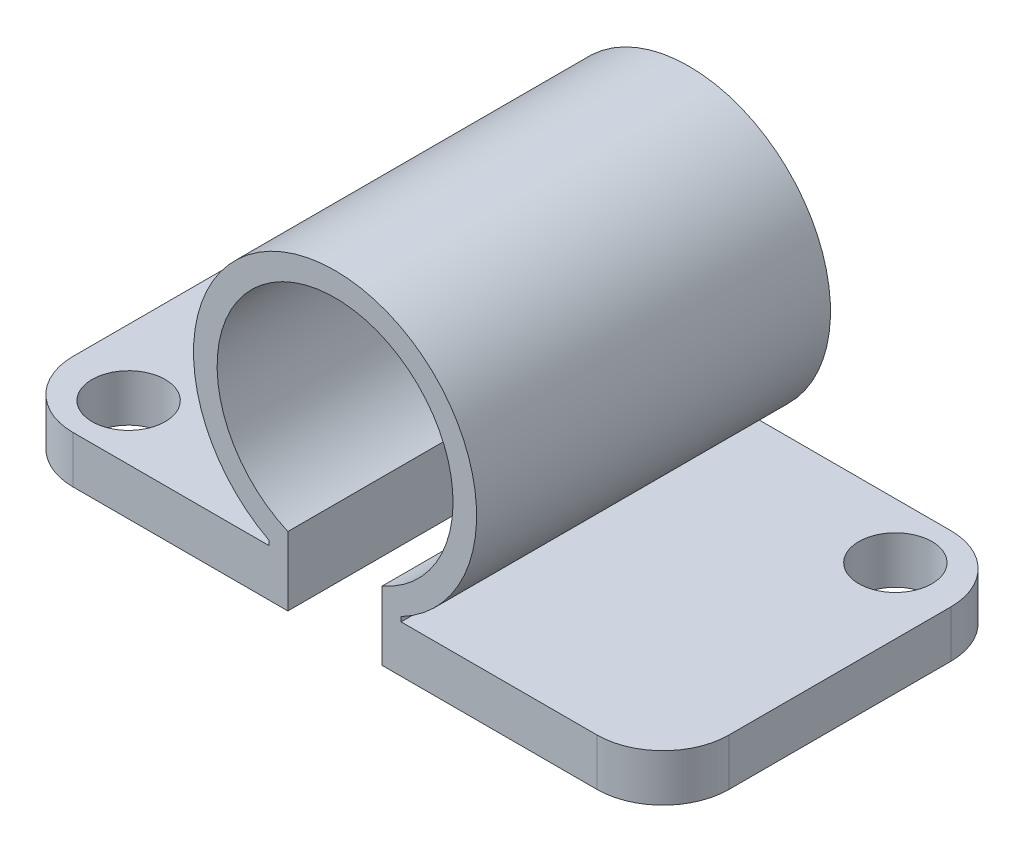
ISO-10303-21;
HEADER;
FILE_DESCRIPTION(('STEP AP214'),'2;1');
FILE_NAME('part.step','',(''),(''),'','','');
FILE_SCHEMA(('AUTOMOTIVE_DESIGN { 1 0 10303 214 1 1 1 1 }'));
ENDSEC;
DATA;
#1=APPLICATION_CONTEXT('core data for automotive mechanical design processes');
#2=APPLICATION_PROTOCOL_DEFINITION('international standard','automotive_design',2000,#1);
#3=PRODUCT_CONTEXT('',#1,'mechanical');
#4=PRODUCT('Part','Part','',(#3));
#5=PRODUCT_RELATED_PRODUCT_CATEGORY('part','',(#4));
#6=PRODUCT_DEFINITION_FORMATION('','',#4);
#7=PRODUCT_DEFINITION_CONTEXT('part definition',#1,'design');
#8=PRODUCT_DEFINITION('design','',#6,#7);
#9=PRODUCT_DEFINITION_SHAPE('','',#8);
#10=(LENGTH_UNIT() NAMED_UNIT(*) SI_UNIT(.MILLI.,.METRE.));
#11=(NAMED_UNIT(*) PLANE_ANGLE_UNIT() SI_UNIT($,.RADIAN.));
#12=(NAMED_UNIT(*) SI_UNIT($,.STERADIAN.) SOLID_ANGLE_UNIT());
#13=UNCERTAINTY_MEASURE_WITH_UNIT(LENGTH_MEASURE(1.E-05),#10,'distance_accuracy_value','');
#14=(GEOMETRIC_REPRESENTATION_CONTEXT(3) GLOBAL_UNCERTAINTY_ASSIGNED_CONTEXT((#13)) GLOBAL_UNIT_ASSIGNED_CONTEXT((#10,
#11,#12)) REPRESENTATION_CONTEXT('',''));
#15=CARTESIAN_POINT('',(0.,0.,0.));
#16=DIRECTION('',(0.,0.,1.));
#17=DIRECTION('',(1.,0.,0.));
#18=AXIS2_PLACEMENT_3D('',#15,#16,#17);
#19=CARTESIAN_POINT('',(0.,0.,15.));
#20=DIRECTION('',(0.,0.,-1.));
#21=DIRECTION('',(-1.,0.,0.));
#22=AXIS2_PLACEMENT_3D('',#19,#20,#21);
#23=CYLINDRICAL_SURFACE('',#22,6.);
#24=CARTESIAN_POINT('',(0.,0.,0.));
#25=DIRECTION('',(0.,0.,1.));
#26=DIRECTION('',(1.,0.,0.));
#27=AXIS2_PLACEMENT_3D('',#24,#25,#26);
#28=CIRCLE('',#27,6.);
#29=CARTESIAN_POINT('',(2.8,-5.30659966456864,0.));
#30=VERTEX_POINT('',#29);
#31=CARTESIAN_POINT('',(-2.8,-5.30659966456864,0.));
#32=VERTEX_POINT('',#31);
#33=EDGE_CURVE('E125',#30,#32,#28,.T.);
#34=ORIENTED_EDGE('',*,*,#33,.T.);
#35=DIRECTION('',(0.,0.,-1.));
#36=VECTOR('',#35,1.);
#37=CARTESIAN_POINT('',(-2.8,-5.30659966456864,15.));
#38=LINE('',#37,#36);
#39=CARTESIAN_POINT('',(-2.8,-5.30659966456864,15.));
#40=VERTEX_POINT('',#39);
#41=EDGE_CURVE('E11',#40,#32,#38,.T.);
#42=ORIENTED_EDGE('',*,*,#41,.F.);
#43=CARTESIAN_POINT('',(0.,0.,15.));
#44=DIRECTION('',(0.,0.,1.));
#45=DIRECTION('',(1.,0.,0.));
#46=AXIS2_PLACEMENT_3D('',#43,#44,#45);
#47=CIRCLE('',#46,6.);
#48=CARTESIAN_POINT('',(2.8,-5.30659966456864,15.));
#49=VERTEX_POINT('',#48);
#50=EDGE_CURVE('E137',#49,#40,#47,.T.);
#51=ORIENTED_EDGE('',*,*,#50,.F.);
#52=DIRECTION('',(0.,0.,-1.));
#53=VECTOR('',#52,1.);
#54=CARTESIAN_POINT('',(2.8,-5.30659966456864,15.));
#55=LINE('',#54,#53);
#56=EDGE_CURVE('E121',#49,#30,#55,.T.);
#57=ORIENTED_EDGE('',*,*,#56,.T.);
#58=EDGE_LOOP('',(#34,#42,#51,#57));
#59=FACE_BOUND('',#58,.T.);
#60=ADVANCED_FACE('F34',(#59),#23,.T.);
#61=CARTESIAN_POINT('',(-2.8,-5.30659966456864,15.));
#62=DIRECTION('',(1.,0.,0.));
#63=DIRECTION('',(0.,1.,0.));
#64=AXIS2_PLACEMENT_3D('',#61,#62,#63);
#65=PLANE('',#64);
#66=DIRECTION('',(0.,-1.,0.));
#67=VECTOR('',#66,1.);
#68=CARTESIAN_POINT('',(-2.8,-5.30659966456864,0.));
#69=LINE('',#68,#67);
#70=CARTESIAN_POINT('',(-2.8,-5.5,0.));
#71=VERTEX_POINT('',#70);
#72=EDGE_CURVE('E128',#32,#71,#69,.T.);
#73=ORIENTED_EDGE('',*,*,#72,.T.);
#74=DIRECTION('',(0.,0.,-1.));
#75=VECTOR('',#74,1.);
#76=CARTESIAN_POINT('',(-2.8,-5.5,15.));
#77=LINE('',#76,#75);
#78=CARTESIAN_POINT('',(-2.8,-5.5,15.));
#79=VERTEX_POINT('',#78);
#80=EDGE_CURVE('E42',#79,#71,#77,.T.);
#81=ORIENTED_EDGE('',*,*,#80,.F.);
#82=DIRECTION('',(0.,-1.,0.));
#83=VECTOR('',#82,1.);
#84=CARTESIAN_POINT('',(-2.8,-5.30659966456864,15.));
#85=LINE('',#84,#83);
#86=EDGE_CURVE('E86',#40,#79,#85,.T.);
#87=ORIENTED_EDGE('',*,*,#86,.F.);
#88=ORIENTED_EDGE('',*,*,#41,.T.);
#89=EDGE_LOOP('',(#73,#81,#87,#88));
#90=FACE_BOUND('',#89,.T.);
#91=ADVANCED_FACE('F231',(#90),#65,.F.);
#92=CARTESIAN_POINT('',(-2.,-5.5,15.));
#93=DIRECTION('',(-1.,0.,0.));
#94=DIRECTION('',(0.,0.,1.));
#95=AXIS2_PLACEMENT_3D('',#92,#93,#94);
#96=PLANE('',#95);
#97=DIRECTION('',(0.,1.,0.));
#98=VECTOR('',#97,1.);
#99=CARTESIAN_POINT('',(-2.,-5.5,0.));
#100=LINE('',#99,#98);
#101=CARTESIAN_POINT('',(-2.,-7.5,0.));
#102=VERTEX_POINT('',#101);
#103=CARTESIAN_POINT('',(-2.,-4.58257569495584,0.));
#104=VERTEX_POINT('',#103);
#105=EDGE_CURVE('E131',#102,#104,#100,.T.);
#106=ORIENTED_EDGE('',*,*,#105,.T.);
#107=DIRECTION('',(0.,0.,-1.));
#108=VECTOR('',#107,1.);
#109=CARTESIAN_POINT('',(-2.,-4.58257569495584,15.));
#110=LINE('',#109,#108);
#111=CARTESIAN_POINT('',(-2.,-4.58257569495584,15.));
#112=VERTEX_POINT('',#111);
#113=EDGE_CURVE('E113',#112,#104,#110,.T.);
#114=ORIENTED_EDGE('',*,*,#113,.F.);
#115=DIRECTION('',(0.,1.,0.));
#116=VECTOR('',#115,1.);
#117=CARTESIAN_POINT('',(-2.,-5.5,15.));
#118=LINE('',#117,#116);
#119=CARTESIAN_POINT('',(-2.,-7.5,15.));
#120=VERTEX_POINT('',#119);
#121=EDGE_CURVE('E105',#120,#112,#118,.T.);
#122=ORIENTED_EDGE('',*,*,#121,.F.);
#123=DIRECTION('',(0.,0.,1.));
#124=VECTOR('',#123,1.);
#125=CARTESIAN_POINT('',(-2.,-7.5,0.));
#126=LINE('',#125,#124);
#127=EDGE_CURVE('E322',#102,#120,#126,.T.);
#128=ORIENTED_EDGE('',*,*,#127,.F.);
#129=EDGE_LOOP('',(#106,#114,#122,#128));
#130=FACE_BOUND('',#129,.T.);
#131=ADVANCED_FACE('F233',(#130),#96,.F.);
#132=CARTESIAN_POINT('',(0.,0.,15.));
#133=DIRECTION('',(0.,0.,-1.));
#134=DIRECTION('',(-1.,0.,0.));
#135=AXIS2_PLACEMENT_3D('',#132,#133,#134);
#136=CYLINDRICAL_SURFACE('',#135,5.);
#137=CARTESIAN_POINT('',(0.,0.,0.));
#138=DIRECTION('',(0.,0.,-1.));
#139=DIRECTION('',(1.,0.,0.));
#140=AXIS2_PLACEMENT_3D('',#137,#138,#139);
#141=CIRCLE('',#140,5.);
#142=CARTESIAN_POINT('',(2.,-4.58257569495584,0.));
#143=VERTEX_POINT('',#142);
#144=EDGE_CURVE('E71',#104,#143,#141,.T.);
#145=ORIENTED_EDGE('',*,*,#144,.T.);
#146=DIRECTION('',(0.,0.,-1.));
#147=VECTOR('',#146,1.);
#148=CARTESIAN_POINT('',(2.,-4.58257569495584,15.));
#149=LINE('',#148,#147);
#150=CARTESIAN_POINT('',(2.,-4.58257569495584,15.));
#151=VERTEX_POINT('',#150);
#152=EDGE_CURVE('E108',#151,#143,#149,.T.);
#153=ORIENTED_EDGE('',*,*,#152,.F.);
#154=CARTESIAN_POINT('',(0.,0.,15.));
#155=DIRECTION('',(0.,0.,-1.));
#156=DIRECTION('',(1.,0.,0.));
#157=AXIS2_PLACEMENT_3D('',#154,#155,#156);
#158=CIRCLE('',#157,5.);
#159=EDGE_CURVE('E96',#112,#151,#158,.T.);
#160=ORIENTED_EDGE('',*,*,#159,.F.);
#161=ORIENTED_EDGE('',*,*,#113,.T.);
#162=EDGE_LOOP('',(#145,#153,#160,#161));
#163=FACE_BOUND('',#162,.T.);
#164=ADVANCED_FACE('F109',(#163),#136,.F.);
#165=CARTESIAN_POINT('',(2.,-5.5,15.));
#166=DIRECTION('',(1.,0.,0.));
#167=DIRECTION('',(0.,0.,-1.));
#168=AXIS2_PLACEMENT_3D('',#165,#166,#167);
#169=PLANE('',#168);
#170=DIRECTION('',(0.,-1.,0.));
#171=VECTOR('',#170,1.);
#172=CARTESIAN_POINT('',(2.,-5.5,0.));
#173=LINE('',#172,#171);
#174=CARTESIAN_POINT('',(2.,-7.5,0.));
#175=VERTEX_POINT('',#174);
#176=EDGE_CURVE('E134',#143,#175,#173,.T.);
#177=ORIENTED_EDGE('',*,*,#176,.T.);
#178=DIRECTION('',(0.,0.,-1.));
#179=VECTOR('',#178,1.);
#180=CARTESIAN_POINT('',(2.,-7.5,0.));
#181=LINE('',#180,#179);
#182=CARTESIAN_POINT('',(2.,-7.5,15.));
#183=VERTEX_POINT('',#182);
#184=EDGE_CURVE('E119',#183,#175,#181,.T.);
#185=ORIENTED_EDGE('',*,*,#184,.F.);
#186=DIRECTION('',(0.,-1.,0.));
#187=VECTOR('',#186,1.);
#188=CARTESIAN_POINT('',(2.,-5.5,15.));
#189=LINE('',#188,#187);
#190=EDGE_CURVE('E101',#151,#183,#189,.T.);
#191=ORIENTED_EDGE('',*,*,#190,.F.);
#192=ORIENTED_EDGE('',*,*,#152,.T.);
#193=EDGE_LOOP('',(#177,#185,#191,#192));
#194=FACE_BOUND('',#193,.T.);
#195=ADVANCED_FACE('F117',(#194),#169,.F.);
#196=CARTESIAN_POINT('',(2.8,-5.30659966456864,15.));
#197=DIRECTION('',(-1.,0.,0.));
#198=DIRECTION('',(0.,-1.,0.));
#199=AXIS2_PLACEMENT_3D('',#196,#197,#198);
#200=PLANE('',#199);
#201=DIRECTION('',(0.,1.,0.));
#202=VECTOR('',#201,1.);
#203=CARTESIAN_POINT('',(2.8,-5.30659966456864,0.));
#204=LINE('',#203,#202);
#205=CARTESIAN_POINT('',(2.8,-5.5,0.));
#206=VERTEX_POINT('',#205);
#207=EDGE_CURVE('E78',#206,#30,#204,.T.);
#208=ORIENTED_EDGE('',*,*,#207,.T.);
#209=ORIENTED_EDGE('',*,*,#56,.F.);
#210=DIRECTION('',(0.,1.,0.));
#211=VECTOR('',#210,1.);
#212=CARTESIAN_POINT('',(2.8,-5.30659966456864,15.));
#213=LINE('',#212,#211);
#214=CARTESIAN_POINT('',(2.8,-5.5,15.));
#215=VERTEX_POINT('',#214);
#216=EDGE_CURVE('E50',#215,#49,#213,.T.);
#217=ORIENTED_EDGE('',*,*,#216,.F.);
#218=DIRECTION('',(0.,0.,-1.));
#219=VECTOR('',#218,1.);
#220=CARTESIAN_POINT('',(2.8,-5.5,15.));
#221=LINE('',#220,#219);
#222=EDGE_CURVE('E114',#215,#206,#221,.T.);
#223=ORIENTED_EDGE('',*,*,#222,.T.);
#224=EDGE_LOOP('',(#208,#209,#217,#223));
#225=FACE_BOUND('',#224,.T.);
#226=ADVANCED_FACE('F245',(#225),#200,.F.);
#227=CARTESIAN_POINT('',(0.,0.,15.));
#228=DIRECTION('',(0.,0.,1.));
#229=DIRECTION('',(1.,0.,0.));
#230=AXIS2_PLACEMENT_3D('',#227,#228,#229);
#231=PLANE('',#230);
#232=ORIENTED_EDGE('',*,*,#50,.T.);
#233=ORIENTED_EDGE('',*,*,#86,.T.);
#234=DIRECTION('',(-1.,0.,0.));
#235=VECTOR('',#234,1.);
#236=CARTESIAN_POINT('',(-2.,-5.5,15.));
#237=LINE('',#236,#235);
#238=CARTESIAN_POINT('',(-11.1,-5.5,15.));
#239=VERTEX_POINT('',#238);
#240=EDGE_CURVE('E151',#79,#239,#237,.T.);
#241=ORIENTED_EDGE('',*,*,#240,.T.);
#242=DIRECTION('',(0.,1.,0.));
#243=VECTOR('',#242,1.);
#244=CARTESIAN_POINT('',(-11.1,-7.5,15.));
#245=LINE('',#244,#243);
#246=CARTESIAN_POINT('',(-11.1,-7.5,15.));
#247=VERTEX_POINT('',#246);
#248=EDGE_CURVE('E168',#247,#239,#245,.T.);
#249=ORIENTED_EDGE('',*,*,#248,.F.);
#250=DIRECTION('',(-1.,0.,0.));
#251=VECTOR('',#250,1.);
#252=CARTESIAN_POINT('',(-2.,-7.5,15.));
#253=LINE('',#252,#251);
#254=EDGE_CURVE('E171',#120,#247,#253,.T.);
#255=ORIENTED_EDGE('',*,*,#254,.F.);
#256=ORIENTED_EDGE('',*,*,#121,.T.);
#257=ORIENTED_EDGE('',*,*,#159,.T.);
#258=ORIENTED_EDGE('',*,*,#190,.T.);
#259=DIRECTION('',(-1.,0.,0.));
#260=VECTOR('',#259,1.);
#261=CARTESIAN_POINT('',(11.1,-7.5,15.));
#262=LINE('',#261,#260);
#263=CARTESIAN_POINT('',(11.1,-7.5,15.));
#264=VERTEX_POINT('',#263);
#265=EDGE_CURVE('E189',#264,#183,#262,.T.);
#266=ORIENTED_EDGE('',*,*,#265,.F.);
#267=DIRECTION('',(0.,1.,0.));
#268=VECTOR('',#267,1.);
#269=CARTESIAN_POINT('',(11.1,-7.5,15.));
#270=LINE('',#269,#268);
#271=CARTESIAN_POINT('',(11.1,-5.5,15.));
#272=VERTEX_POINT('',#271);
#273=EDGE_CURVE('E129',#264,#272,#270,.T.);
#274=ORIENTED_EDGE('',*,*,#273,.T.);
#275=DIRECTION('',(-1.,0.,0.));
#276=VECTOR('',#275,1.);
#277=CARTESIAN_POINT('',(11.1,-5.5,15.));
#278=LINE('',#277,#276);
#279=EDGE_CURVE('E205',#272,#215,#278,.T.);
#280=ORIENTED_EDGE('',*,*,#279,.T.);
#281=ORIENTED_EDGE('',*,*,#216,.T.);
#282=EDGE_LOOP('',(#232,#233,#241,#249,#255,#256,#257,#258,#266,#274,#280,#281));
#283=FACE_BOUND('',#282,.T.);
#284=ADVANCED_FACE('F97',(#283),#231,.T.);
#285=CARTESIAN_POINT('',(0.,0.,0.));
#286=DIRECTION('',(0.,0.,1.));
#287=DIRECTION('',(1.,0.,0.));
#288=AXIS2_PLACEMENT_3D('',#285,#286,#287);
#289=PLANE('',#288);
#290=ORIENTED_EDGE('',*,*,#33,.F.);
#291=ORIENTED_EDGE('',*,*,#207,.F.);
#292=DIRECTION('',(1.,0.,0.));
#293=VECTOR('',#292,1.);
#294=CARTESIAN_POINT('',(11.1,-5.5,0.));
#295=LINE('',#294,#293);
#296=CARTESIAN_POINT('',(11.1,-5.5,0.));
#297=VERTEX_POINT('',#296);
#298=EDGE_CURVE('E207',#206,#297,#295,.T.);
#299=ORIENTED_EDGE('',*,*,#298,.T.);
#300=DIRECTION('',(0.,1.,0.));
#301=VECTOR('',#300,1.);
#302=CARTESIAN_POINT('',(11.1,-7.5,0.));
#303=LINE('',#302,#301);
#304=CARTESIAN_POINT('',(11.1,-7.5,0.));
#305=VERTEX_POINT('',#304);
#306=EDGE_CURVE('E220',#305,#297,#303,.T.);
#307=ORIENTED_EDGE('',*,*,#306,.F.);
#308=DIRECTION('',(1.,0.,0.));
#309=VECTOR('',#308,1.);
#310=CARTESIAN_POINT('',(11.1,-7.5,0.));
#311=LINE('',#310,#309);
#312=EDGE_CURVE('E193',#175,#305,#311,.T.);
#313=ORIENTED_EDGE('',*,*,#312,.F.);
#314=ORIENTED_EDGE('',*,*,#176,.F.);
#315=ORIENTED_EDGE('',*,*,#144,.F.);
#316=ORIENTED_EDGE('',*,*,#105,.F.);
#317=DIRECTION('',(1.,0.,0.));
#318=VECTOR('',#317,1.);
#319=CARTESIAN_POINT('',(-2.,-7.5,0.));
#320=LINE('',#319,#318);
#321=CARTESIAN_POINT('',(-11.1,-7.5,0.));
#322=VERTEX_POINT('',#321);
#323=EDGE_CURVE('E319',#322,#102,#320,.T.);
#324=ORIENTED_EDGE('',*,*,#323,.F.);
#325=DIRECTION('',(0.,1.,0.));
#326=VECTOR('',#325,1.);
#327=CARTESIAN_POINT('',(-11.1,-7.5,0.));
#328=LINE('',#327,#326);
#329=CARTESIAN_POINT('',(-11.1,-5.5,0.));
#330=VERTEX_POINT('',#329);
#331=EDGE_CURVE('E158',#322,#330,#328,.T.);
#332=ORIENTED_EDGE('',*,*,#331,.T.);
#333=DIRECTION('',(1.,0.,0.));
#334=VECTOR('',#333,1.);
#335=CARTESIAN_POINT('',(-2.,-5.5,0.));
#336=LINE('',#335,#334);
#337=EDGE_CURVE('E148',#330,#71,#336,.T.);
#338=ORIENTED_EDGE('',*,*,#337,.T.);
#339=ORIENTED_EDGE('',*,*,#72,.F.);
#340=EDGE_LOOP('',(#290,#291,#299,#307,#313,#314,#315,#316,#324,#332,#338,#339));
#341=FACE_BOUND('',#340,.T.);
#342=ADVANCED_FACE('F155',(#341),#289,.F.);
#343=CARTESIAN_POINT('',(11.1,-5.5,12.2));
#344=DIRECTION('',(0.,-1.,0.));
#345=DIRECTION('',(0.,0.,-1.));
#346=AXIS2_PLACEMENT_3D('',#343,#344,#345);
#347=PLANE('',#346);
#348=CARTESIAN_POINT('',(11.1,-5.5,2.35));
#349=DIRECTION('',(0.,-1.,0.));
#350=DIRECTION('',(0.,0.,-1.));
#351=AXIS2_PLACEMENT_3D('',#348,#349,#350);
#352=CIRCLE('',#351,1.55);
#353=CARTESIAN_POINT('',(11.1,-5.5,0.800000000000002));
#354=VERTEX_POINT('',#353);
#355=EDGE_CURVE('E179',#354,#354,#352,.T.);
#356=ORIENTED_EDGE('',*,*,#355,.T.);
#357=EDGE_LOOP('',(#356));
#358=FACE_BOUND('',#357,.T.);
#359=ORIENTED_EDGE('',*,*,#298,.F.);
#360=ORIENTED_EDGE('',*,*,#222,.F.);
#361=ORIENTED_EDGE('',*,*,#279,.F.);
#362=CARTESIAN_POINT('',(11.1,-5.5,12.2));
#363=DIRECTION('',(0.,-1.,0.));
#364=DIRECTION('',(0.,0.,-1.));
#365=AXIS2_PLACEMENT_3D('',#362,#363,#364);
#366=CIRCLE('',#365,2.8);
#367=CARTESIAN_POINT('',(13.9,-5.5,12.2));
#368=VERTEX_POINT('',#367);
#369=EDGE_CURVE('E183',#368,#272,#366,.T.);
#370=ORIENTED_EDGE('',*,*,#369,.F.);
#371=DIRECTION('',(0.,0.,1.));
#372=VECTOR('',#371,1.);
#373=CARTESIAN_POINT('',(13.9,-5.5,2.80000000000002));
#374=LINE('',#373,#372);
#375=CARTESIAN_POINT('',(13.9,-5.5,2.80000000000002));
#376=VERTEX_POINT('',#375);
#377=EDGE_CURVE('E190',#376,#368,#374,.T.);
#378=ORIENTED_EDGE('',*,*,#377,.F.);
#379=CARTESIAN_POINT('',(11.1,-5.5,2.8));
#380=DIRECTION('',(0.,-1.,0.));
#381=DIRECTION('',(0.,0.,1.));
#382=AXIS2_PLACEMENT_3D('',#379,#380,#381);
#383=CIRCLE('',#382,2.8);
#384=EDGE_CURVE('E210',#297,#376,#383,.T.);
#385=ORIENTED_EDGE('',*,*,#384,.F.);
#386=EDGE_LOOP('',(#359,#360,#361,#370,#378,#385));
#387=FACE_BOUND('',#386,.T.);
#388=ADVANCED_FACE('F250',(#358,#387),#347,.F.);
#389=CARTESIAN_POINT('',(11.1,-7.5,12.2));
#390=DIRECTION('',(0.,-1.,0.));
#391=DIRECTION('',(0.,0.,-1.));
#392=AXIS2_PLACEMENT_3D('',#389,#390,#391);
#393=PLANE('',#392);
#394=CARTESIAN_POINT('',(11.1,-7.5,12.2));
#395=DIRECTION('',(0.,-1.,0.));
#396=DIRECTION('',(0.,0.,-1.));
#397=AXIS2_PLACEMENT_3D('',#394,#395,#396);
#398=CIRCLE('',#397,2.8);
#399=CARTESIAN_POINT('',(13.9,-7.5,12.2));
#400=VERTEX_POINT('',#399);
#401=EDGE_CURVE('E186',#400,#264,#398,.T.);
#402=ORIENTED_EDGE('',*,*,#401,.T.);
#403=ORIENTED_EDGE('',*,*,#265,.T.);
#404=ORIENTED_EDGE('',*,*,#184,.T.);
#405=ORIENTED_EDGE('',*,*,#312,.T.);
#406=CARTESIAN_POINT('',(11.1,-7.5,2.8));
#407=DIRECTION('',(0.,-1.,0.));
#408=DIRECTION('',(0.,0.,1.));
#409=AXIS2_PLACEMENT_3D('',#406,#407,#408);
#410=CIRCLE('',#409,2.8);
#411=CARTESIAN_POINT('',(13.9,-7.5,2.80000000000002));
#412=VERTEX_POINT('',#411);
#413=EDGE_CURVE('E196',#305,#412,#410,.T.);
#414=ORIENTED_EDGE('',*,*,#413,.T.);
#415=DIRECTION('',(0.,0.,1.));
#416=VECTOR('',#415,1.);
#417=CARTESIAN_POINT('',(13.9,-7.5,2.80000000000002));
#418=LINE('',#417,#416);
#419=EDGE_CURVE('E199',#412,#400,#418,.T.);
#420=ORIENTED_EDGE('',*,*,#419,.T.);
#421=EDGE_LOOP('',(#402,#403,#404,#405,#414,#420));
#422=FACE_BOUND('',#421,.T.);
#423=CARTESIAN_POINT('',(11.1,-7.5,2.35));
#424=DIRECTION('',(0.,-1.,0.));
#425=DIRECTION('',(0.,0.,-1.));
#426=AXIS2_PLACEMENT_3D('',#423,#424,#425);
#427=CIRCLE('',#426,1.55);
#428=CARTESIAN_POINT('',(11.1,-7.5,0.800000000000002));
#429=VERTEX_POINT('',#428);
#430=EDGE_CURVE('E180',#429,#429,#427,.T.);
#431=ORIENTED_EDGE('',*,*,#430,.F.);
#432=EDGE_LOOP('',(#431));
#433=FACE_BOUND('',#432,.T.);
#434=ADVANCED_FACE('F257',(#422,#433),#393,.T.);
#435=CARTESIAN_POINT('',(11.1,-7.5,12.2));
#436=DIRECTION('',(0.,1.,0.));
#437=DIRECTION('',(0.,0.,1.));
#438=AXIS2_PLACEMENT_3D('',#435,#436,#437);
#439=CYLINDRICAL_SURFACE('',#438,2.8);
#440=ORIENTED_EDGE('',*,*,#369,.T.);
#441=ORIENTED_EDGE('',*,*,#273,.F.);
#442=ORIENTED_EDGE('',*,*,#401,.F.);
#443=DIRECTION('',(0.,1.,0.));
#444=VECTOR('',#443,1.);
#445=CARTESIAN_POINT('',(13.9,-7.5,12.2));
#446=LINE('',#445,#444);
#447=EDGE_CURVE('E202',#400,#368,#446,.T.);
#448=ORIENTED_EDGE('',*,*,#447,.T.);
#449=EDGE_LOOP('',(#440,#441,#442,#448));
#450=FACE_BOUND('',#449,.T.);
#451=ADVANCED_FACE('F253',(#450),#439,.T.);
#452=CARTESIAN_POINT('',(11.1,-7.5,2.8));
#453=DIRECTION('',(0.,1.,0.));
#454=DIRECTION('',(0.,0.,1.));
#455=AXIS2_PLACEMENT_3D('',#452,#453,#454);
#456=CYLINDRICAL_SURFACE('',#455,2.8);
#457=ORIENTED_EDGE('',*,*,#384,.T.);
#458=DIRECTION('',(0.,1.,0.));
#459=VECTOR('',#458,1.);
#460=CARTESIAN_POINT('',(13.9,-7.5,2.80000000000002));
#461=LINE('',#460,#459);
#462=EDGE_CURVE('E217',#412,#376,#461,.T.);
#463=ORIENTED_EDGE('',*,*,#462,.F.);
#464=ORIENTED_EDGE('',*,*,#413,.F.);
#465=ORIENTED_EDGE('',*,*,#306,.T.);
#466=EDGE_LOOP('',(#457,#463,#464,#465));
#467=FACE_BOUND('',#466,.T.);
#468=ADVANCED_FACE('F256',(#467),#456,.T.);
#469=CARTESIAN_POINT('',(13.9,-7.5,2.80000000000002));
#470=DIRECTION('',(-1.,0.,0.));
#471=DIRECTION('',(0.,0.,1.));
#472=AXIS2_PLACEMENT_3D('',#469,#470,#471);
#473=PLANE('',#472);
#474=ORIENTED_EDGE('',*,*,#377,.T.);
#475=ORIENTED_EDGE('',*,*,#447,.F.);
#476=ORIENTED_EDGE('',*,*,#419,.F.);
#477=ORIENTED_EDGE('',*,*,#462,.T.);
#478=EDGE_LOOP('',(#474,#475,#476,#477));
#479=FACE_BOUND('',#478,.T.);
#480=ADVANCED_FACE('F261',(#479),#473,.F.);
#481=CARTESIAN_POINT('',(11.1,-7.5,2.35));
#482=DIRECTION('',(0.,1.,0.));
#483=DIRECTION('',(0.,0.,1.));
#484=AXIS2_PLACEMENT_3D('',#481,#482,#483);
#485=CYLINDRICAL_SURFACE('',#484,1.55);
#486=ORIENTED_EDGE('',*,*,#430,.T.);
#487=EDGE_LOOP('',(#486));
#488=FACE_BOUND('',#487,.T.);
#489=ORIENTED_EDGE('',*,*,#355,.F.);
#490=EDGE_LOOP('',(#489));
#491=FACE_BOUND('',#490,.T.);
#492=ADVANCED_FACE('F265',(#488,#491),#485,.F.);
#493=CARTESIAN_POINT('',(-11.1,-5.5,12.2));
#494=DIRECTION('',(0.,-1.,0.));
#495=DIRECTION('',(0.,0.,-1.));
#496=AXIS2_PLACEMENT_3D('',#493,#494,#495);
#497=PLANE('',#496);
#498=CARTESIAN_POINT('',(-11.1,-5.5,12.65));
#499=DIRECTION('',(0.,-1.,0.));
#500=DIRECTION('',(0.,0.,-1.));
#501=AXIS2_PLACEMENT_3D('',#498,#499,#500);
#502=CIRCLE('',#501,1.55);
#503=CARTESIAN_POINT('',(-11.1,-5.5,11.1));
#504=VERTEX_POINT('',#503);
#505=EDGE_CURVE('E306',#504,#504,#502,.T.);
#506=ORIENTED_EDGE('',*,*,#505,.T.);
#507=EDGE_LOOP('',(#506));
#508=FACE_BOUND('',#507,.T.);
#509=ORIENTED_EDGE('',*,*,#240,.F.);
#510=ORIENTED_EDGE('',*,*,#80,.T.);
#511=ORIENTED_EDGE('',*,*,#337,.F.);
#512=CARTESIAN_POINT('',(-11.1,-5.5,2.8));
#513=DIRECTION('',(0.,-1.,0.));
#514=DIRECTION('',(0.,0.,-1.));
#515=AXIS2_PLACEMENT_3D('',#512,#513,#514);
#516=CIRCLE('',#515,2.8);
#517=CARTESIAN_POINT('',(-13.9,-5.5,2.80000000000002));
#518=VERTEX_POINT('',#517);
#519=EDGE_CURVE('E159',#518,#330,#516,.T.);
#520=ORIENTED_EDGE('',*,*,#519,.F.);
#521=DIRECTION('',(0.,0.,-1.));
#522=VECTOR('',#521,1.);
#523=CARTESIAN_POINT('',(-13.9,-5.5,2.80000000000002));
#524=LINE('',#523,#522);
#525=CARTESIAN_POINT('',(-13.9,-5.5,12.2));
#526=VERTEX_POINT('',#525);
#527=EDGE_CURVE('E164',#526,#518,#524,.T.);
#528=ORIENTED_EDGE('',*,*,#527,.F.);
#529=CARTESIAN_POINT('',(-11.1,-5.5,12.2));
#530=DIRECTION('',(0.,-1.,0.));
#531=DIRECTION('',(0.,0.,-1.));
#532=AXIS2_PLACEMENT_3D('',#529,#530,#531);
#533=CIRCLE('',#532,2.8);
#534=EDGE_CURVE('E308',#239,#526,#533,.T.);
#535=ORIENTED_EDGE('',*,*,#534,.F.);
#536=EDGE_LOOP('',(#509,#510,#511,#520,#528,#535));
#537=FACE_BOUND('',#536,.T.);
#538=ADVANCED_FACE('F145',(#508,#537),#497,.F.);
#539=CARTESIAN_POINT('',(-11.1,-7.5,12.2));
#540=DIRECTION('',(0.,-1.,0.));
#541=DIRECTION('',(0.,0.,-1.));
#542=AXIS2_PLACEMENT_3D('',#539,#540,#541);
#543=PLANE('',#542);
#544=CARTESIAN_POINT('',(-11.1,-7.5,12.2));
#545=DIRECTION('',(0.,-1.,0.));
#546=DIRECTION('',(0.,0.,-1.));
#547=AXIS2_PLACEMENT_3D('',#544,#545,#546);
#548=CIRCLE('',#547,2.8);
#549=CARTESIAN_POINT('',(-13.9,-7.5,12.2));
#550=VERTEX_POINT('',#549);
#551=EDGE_CURVE('E161',#247,#550,#548,.T.);
#552=ORIENTED_EDGE('',*,*,#551,.T.);
#553=DIRECTION('',(0.,0.,-1.));
#554=VECTOR('',#553,1.);
#555=CARTESIAN_POINT('',(-13.9,-7.5,2.80000000000002));
#556=LINE('',#555,#554);
#557=CARTESIAN_POINT('',(-13.9,-7.5,2.80000000000002));
#558=VERTEX_POINT('',#557);
#559=EDGE_CURVE('E313',#550,#558,#556,.T.);
#560=ORIENTED_EDGE('',*,*,#559,.T.);
#561=CARTESIAN_POINT('',(-11.1,-7.5,2.8));
#562=DIRECTION('',(0.,-1.,0.));
#563=DIRECTION('',(0.,0.,-1.));
#564=AXIS2_PLACEMENT_3D('',#561,#562,#563);
#565=CIRCLE('',#564,2.8);
#566=EDGE_CURVE('E316',#558,#322,#565,.T.);
#567=ORIENTED_EDGE('',*,*,#566,.T.);
#568=ORIENTED_EDGE('',*,*,#323,.T.);
#569=ORIENTED_EDGE('',*,*,#127,.T.);
#570=ORIENTED_EDGE('',*,*,#254,.T.);
#571=EDGE_LOOP('',(#552,#560,#567,#568,#569,#570));
#572=FACE_BOUND('',#571,.T.);
#573=CARTESIAN_POINT('',(-11.1,-7.5,12.65));
#574=DIRECTION('',(0.,-1.,0.));
#575=DIRECTION('',(0.,0.,-1.));
#576=AXIS2_PLACEMENT_3D('',#573,#574,#575);
#577=CIRCLE('',#576,1.55);
#578=CARTESIAN_POINT('',(-11.1,-7.5,11.1));
#579=VERTEX_POINT('',#578);
#580=EDGE_CURVE('E303',#579,#579,#577,.T.);
#581=ORIENTED_EDGE('',*,*,#580,.F.);
#582=EDGE_LOOP('',(#581));
#583=FACE_BOUND('',#582,.T.);
#584=ADVANCED_FACE('F280',(#572,#583),#543,.T.);
#585=CARTESIAN_POINT('',(-11.1,-7.5,12.2));
#586=DIRECTION('',(0.,1.,0.));
#587=DIRECTION('',(0.,0.,1.));
#588=AXIS2_PLACEMENT_3D('',#585,#586,#587);
#589=CYLINDRICAL_SURFACE('',#588,2.8);
#590=ORIENTED_EDGE('',*,*,#534,.T.);
#591=DIRECTION('',(0.,1.,0.));
#592=VECTOR('',#591,1.);
#593=CARTESIAN_POINT('',(-13.9,-7.5,12.2));
#594=LINE('',#593,#592);
#595=EDGE_CURVE('E176',#550,#526,#594,.T.);
#596=ORIENTED_EDGE('',*,*,#595,.F.);
#597=ORIENTED_EDGE('',*,*,#551,.F.);
#598=ORIENTED_EDGE('',*,*,#248,.T.);
#599=EDGE_LOOP('',(#590,#596,#597,#598));
#600=FACE_BOUND('',#599,.T.);
#601=ADVANCED_FACE('F276',(#600),#589,.T.);
#602=CARTESIAN_POINT('',(-13.9,-7.5,2.80000000000002));
#603=DIRECTION('',(1.,0.,0.));
#604=DIRECTION('',(0.,0.,-1.));
#605=AXIS2_PLACEMENT_3D('',#602,#603,#604);
#606=PLANE('',#605);
#607=ORIENTED_EDGE('',*,*,#527,.T.);
#608=DIRECTION('',(0.,1.,0.));
#609=VECTOR('',#608,1.);
#610=CARTESIAN_POINT('',(-13.9,-7.5,2.80000000000002));
#611=LINE('',#610,#609);
#612=EDGE_CURVE('E173',#558,#518,#611,.T.);
#613=ORIENTED_EDGE('',*,*,#612,.F.);
#614=ORIENTED_EDGE('',*,*,#559,.F.);
#615=ORIENTED_EDGE('',*,*,#595,.T.);
#616=EDGE_LOOP('',(#607,#613,#614,#615));
#617=FACE_BOUND('',#616,.T.);
#618=ADVANCED_FACE('F279',(#617),#606,.F.);
#619=CARTESIAN_POINT('',(-11.1,-7.5,2.8));
#620=DIRECTION('',(0.,1.,0.));
#621=DIRECTION('',(0.,0.,1.));
#622=AXIS2_PLACEMENT_3D('',#619,#620,#621);
#623=CYLINDRICAL_SURFACE('',#622,2.8);
#624=ORIENTED_EDGE('',*,*,#519,.T.);
#625=ORIENTED_EDGE('',*,*,#331,.F.);
#626=ORIENTED_EDGE('',*,*,#566,.F.);
#627=ORIENTED_EDGE('',*,*,#612,.T.);
#628=EDGE_LOOP('',(#624,#625,#626,#627));
#629=FACE_BOUND('',#628,.T.);
#630=ADVANCED_FACE('F284',(#629),#623,.T.);
#631=CARTESIAN_POINT('',(-11.1,-7.5,12.65));
#632=DIRECTION('',(0.,1.,0.));
#633=DIRECTION('',(0.,0.,1.));
#634=AXIS2_PLACEMENT_3D('',#631,#632,#633);
#635=CYLINDRICAL_SURFACE('',#634,1.55);
#636=ORIENTED_EDGE('',*,*,#580,.T.);
#637=EDGE_LOOP('',(#636));
#638=FACE_BOUND('',#637,.T.);
#639=ORIENTED_EDGE('',*,*,#505,.F.);
#640=EDGE_LOOP('',(#639));
#641=FACE_BOUND('',#640,.T.);
#642=ADVANCED_FACE('F288',(#638,#641),#635,.F.);
#643=CLOSED_SHELL('',(#60,#91,#131,#164,#195,#226,#284,#342,#388,#434,#451,#468,#480,#492,#538,
#584,#601,#618,#630,#642));
#644=MANIFOLD_SOLID_BREP('B2',#643);
#645=ADVANCED_BREP_SHAPE_REPRESENTATION('',(#18,#644),#14);
#646=SHAPE_DEFINITION_REPRESENTATION(#9,#645);
ENDSEC;
END-ISO-10303-21;
